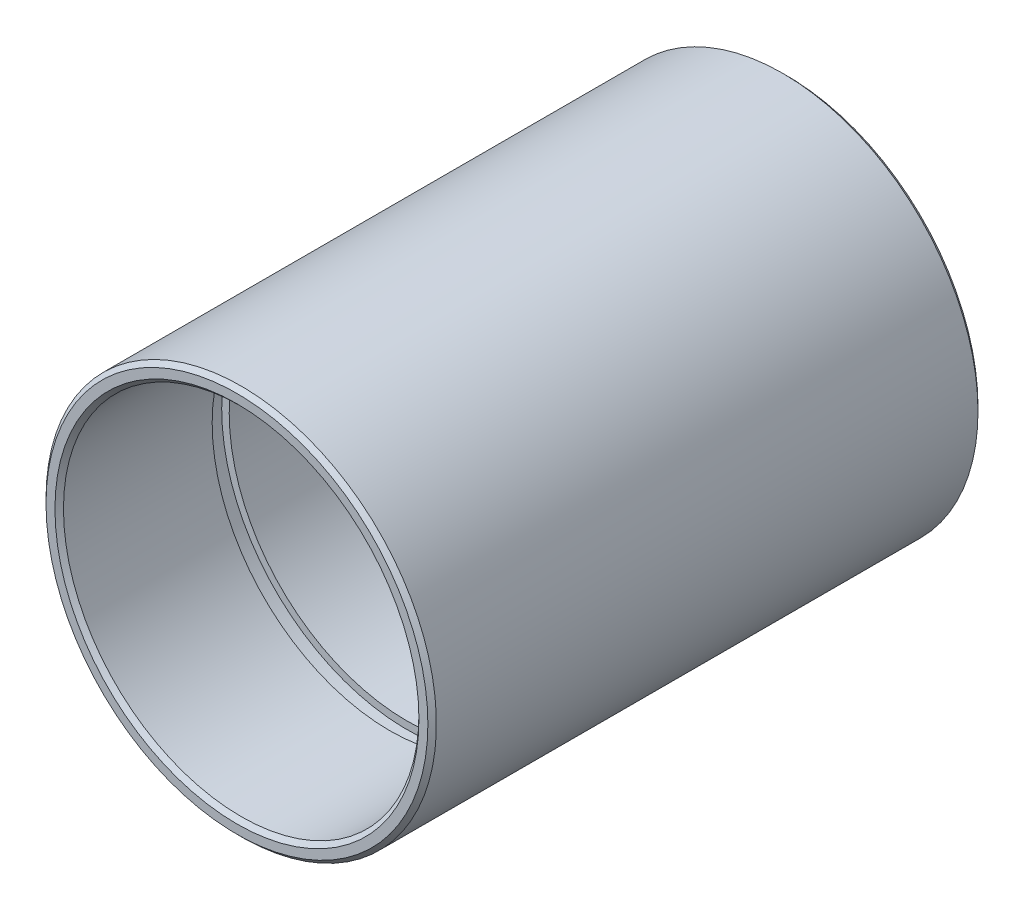
ISO-10303-21;
HEADER;
FILE_DESCRIPTION(('STEP AP214'),'2;1');
FILE_NAME('part.step','',(''),(''),'','','');
FILE_SCHEMA(('AUTOMOTIVE_DESIGN { 1 0 10303 214 1 1 1 1 }'));
ENDSEC;
DATA;
#1=APPLICATION_CONTEXT('core data for automotive mechanical design processes');
#2=APPLICATION_PROTOCOL_DEFINITION('international standard','automotive_design',2000,#1);
#3=PRODUCT_CONTEXT('',#1,'mechanical');
#4=PRODUCT('Part','Part','',(#3));
#5=PRODUCT_RELATED_PRODUCT_CATEGORY('part','',(#4));
#6=PRODUCT_DEFINITION_FORMATION('','',#4);
#7=PRODUCT_DEFINITION_CONTEXT('part definition',#1,'design');
#8=PRODUCT_DEFINITION('design','',#6,#7);
#9=PRODUCT_DEFINITION_SHAPE('','',#8);
#10=(LENGTH_UNIT() NAMED_UNIT(*) SI_UNIT(.MILLI.,.METRE.));
#11=(NAMED_UNIT(*) PLANE_ANGLE_UNIT() SI_UNIT($,.RADIAN.));
#12=(NAMED_UNIT(*) SI_UNIT($,.STERADIAN.) SOLID_ANGLE_UNIT());
#13=UNCERTAINTY_MEASURE_WITH_UNIT(LENGTH_MEASURE(1.E-05),#10,'distance_accuracy_value','');
#14=(GEOMETRIC_REPRESENTATION_CONTEXT(3) GLOBAL_UNCERTAINTY_ASSIGNED_CONTEXT((#13)) GLOBAL_UNIT_ASSIGNED_CONTEXT((#10,
#11,#12)) REPRESENTATION_CONTEXT('',''));
#15=CARTESIAN_POINT('',(0.,0.,0.));
#16=DIRECTION('',(0.,0.,1.));
#17=DIRECTION('',(1.,0.,0.));
#18=AXIS2_PLACEMENT_3D('',#15,#16,#17);
#19=CARTESIAN_POINT('',(0.,0.,49.2125));
#20=DIRECTION('',(0.,0.,-1.));
#21=DIRECTION('',(-1.,0.,0.));
#22=AXIS2_PLACEMENT_3D('',#19,#20,#21);
#23=CYLINDRICAL_SURFACE('',#22,15.9004);
#24=CARTESIAN_POINT('',(0.,0.,15.20825));
#25=DIRECTION('',(0.,0.,1.));
#26=DIRECTION('',(1.,0.,0.));
#27=AXIS2_PLACEMENT_3D('',#24,#25,#26);
#28=CIRCLE('',#27,15.9004);
#29=CARTESIAN_POINT('',(15.9004,0.,15.20825));
#30=VERTEX_POINT('',#29);
#31=EDGE_CURVE('E73',#30,#30,#28,.T.);
#32=ORIENTED_EDGE('',*,*,#31,.F.);
#33=EDGE_LOOP('',(#32));
#34=FACE_BOUND('',#33,.T.);
#35=CARTESIAN_POINT('',(0.,0.,34.00425));
#36=DIRECTION('',(0.,0.,1.));
#37=DIRECTION('',(1.,0.,0.));
#38=AXIS2_PLACEMENT_3D('',#35,#36,#37);
#39=CIRCLE('',#38,15.9004);
#40=CARTESIAN_POINT('',(15.9004,0.,34.00425));
#41=VERTEX_POINT('',#40);
#42=EDGE_CURVE('E67',#41,#41,#39,.T.);
#43=ORIENTED_EDGE('',*,*,#42,.T.);
#44=EDGE_LOOP('',(#43));
#45=FACE_BOUND('',#44,.T.);
#46=ADVANCED_FACE('F30',(#34,#45),#23,.F.);
#47=CARTESIAN_POINT('',(0.,0.,0.381000000000006));
#48=DIRECTION('',(0.,0.,1.));
#49=DIRECTION('',(1.,0.,0.));
#50=AXIS2_PLACEMENT_3D('',#47,#48,#49);
#51=CIRCLE('',#50,15.9004);
#52=CARTESIAN_POINT('',(-15.9004,0.,0.381000000000006));
#53=VERTEX_POINT('',#52);
#54=EDGE_CURVE('E10',#53,#53,#51,.F.);
#55=ORIENTED_EDGE('',*,*,#54,.T.);
#56=EDGE_LOOP('',(#55));
#57=FACE_BOUND('',#56,.T.);
#58=CARTESIAN_POINT('',(0.,0.,13.68425));
#59=DIRECTION('',(0.,0.,1.));
#60=DIRECTION('',(1.,0.,0.));
#61=AXIS2_PLACEMENT_3D('',#58,#59,#60);
#62=CIRCLE('',#61,15.9004);
#63=CARTESIAN_POINT('',(15.9004,0.,13.68425));
#64=VERTEX_POINT('',#63);
#65=EDGE_CURVE('E62',#64,#64,#62,.T.);
#66=ORIENTED_EDGE('',*,*,#65,.T.);
#67=EDGE_LOOP('',(#66));
#68=FACE_BOUND('',#67,.T.);
#69=ADVANCED_FACE('F105',(#57,#68),#23,.F.);
#70=CARTESIAN_POINT('',(0.,0.,49.2125));
#71=DIRECTION('',(0.,0.,1.));
#72=DIRECTION('',(1.,0.,0.));
#73=AXIS2_PLACEMENT_3D('',#70,#71,#72);
#74=PLANE('',#73);
#75=CARTESIAN_POINT('',(0.,0.,49.2125));
#76=DIRECTION('',(0.,0.,1.));
#77=DIRECTION('',(1.,0.,0.));
#78=AXIS2_PLACEMENT_3D('',#75,#76,#77);
#79=CIRCLE('',#78,16.2814);
#80=CARTESIAN_POINT('',(16.2814,0.,49.2125));
#81=VERTEX_POINT('',#80);
#82=EDGE_CURVE('E53',#81,#81,#79,.F.);
#83=ORIENTED_EDGE('',*,*,#82,.T.);
#84=EDGE_LOOP('',(#83));
#85=FACE_BOUND('',#84,.T.);
#86=CARTESIAN_POINT('',(0.,0.,49.2125));
#87=DIRECTION('',(0.,0.,1.));
#88=DIRECTION('',(1.,0.,0.));
#89=AXIS2_PLACEMENT_3D('',#86,#87,#88);
#90=CIRCLE('',#89,17.0815);
#91=CARTESIAN_POINT('',(-17.0815,0.,49.2125));
#92=VERTEX_POINT('',#91);
#93=EDGE_CURVE('E56',#92,#92,#90,.T.);
#94=ORIENTED_EDGE('',*,*,#93,.T.);
#95=EDGE_LOOP('',(#94));
#96=FACE_BOUND('',#95,.T.);
#97=ADVANCED_FACE('F112',(#85,#96),#74,.T.);
#98=CARTESIAN_POINT('',(0.,0.,0.));
#99=DIRECTION('',(0.,0.,1.));
#100=DIRECTION('',(1.,0.,0.));
#101=AXIS2_PLACEMENT_3D('',#98,#99,#100);
#102=PLANE('',#101);
#103=CARTESIAN_POINT('',(0.,0.,0.));
#104=DIRECTION('',(0.,0.,1.));
#105=DIRECTION('',(1.,0.,0.));
#106=AXIS2_PLACEMENT_3D('',#103,#104,#105);
#107=CIRCLE('',#106,16.2814);
#108=CARTESIAN_POINT('',(-16.2814,0.,0.));
#109=VERTEX_POINT('',#108);
#110=EDGE_CURVE('E37',#109,#109,#107,.T.);
#111=ORIENTED_EDGE('',*,*,#110,.T.);
#112=EDGE_LOOP('',(#111));
#113=FACE_BOUND('',#112,.T.);
#114=CARTESIAN_POINT('',(0.,0.,0.));
#115=DIRECTION('',(0.,0.,1.));
#116=DIRECTION('',(1.,0.,0.));
#117=AXIS2_PLACEMENT_3D('',#114,#115,#116);
#118=CIRCLE('',#117,17.0815);
#119=CARTESIAN_POINT('',(17.0815,0.,0.));
#120=VERTEX_POINT('',#119);
#121=EDGE_CURVE('E41',#120,#120,#118,.F.);
#122=ORIENTED_EDGE('',*,*,#121,.T.);
#123=EDGE_LOOP('',(#122));
#124=FACE_BOUND('',#123,.T.);
#125=ADVANCED_FACE('F127',(#113,#124),#102,.F.);
#126=CARTESIAN_POINT('',(0.,0.,49.2125));
#127=DIRECTION('',(0.,0.,-1.));
#128=DIRECTION('',(-1.,0.,0.));
#129=AXIS2_PLACEMENT_3D('',#126,#127,#128);
#130=CYLINDRICAL_SURFACE('',#129,17.4625);
#131=CARTESIAN_POINT('',(0.,0.,48.8315));
#132=DIRECTION('',(0.,0.,1.));
#133=DIRECTION('',(1.,0.,0.));
#134=AXIS2_PLACEMENT_3D('',#131,#132,#133);
#135=CIRCLE('',#134,17.4625);
#136=CARTESIAN_POINT('',(-17.4625,0.,48.8315));
#137=VERTEX_POINT('',#136);
#138=EDGE_CURVE('E45',#137,#137,#135,.F.);
#139=CARTESIAN_POINT('',(0.,0.,0.381000000000006));
#140=DIRECTION('',(0.,0.,1.));
#141=DIRECTION('',(1.,0.,0.));
#142=AXIS2_PLACEMENT_3D('',#139,#140,#141);
#143=CIRCLE('',#142,17.4625);
#144=CARTESIAN_POINT('',(-17.4625,0.,0.380999999999999));
#145=VERTEX_POINT('',#144);
#146=EDGE_CURVE('E50',#145,#145,#143,.T.);
#147=CARTESIAN_POINT('',(-17.4625,0.,48.8315));
#148=CARTESIAN_POINT('',(-17.4625,0.,48.3268072916667));
#149=CARTESIAN_POINT('',(-17.4625,0.,47.8221145833333));
#150=CARTESIAN_POINT('',(-17.4625,0.,46.8127291666667));
#151=CARTESIAN_POINT('',(-17.4625,0.,46.3080364583333));
#152=CARTESIAN_POINT('',(-17.4625,0.,45.2986510416667));
#153=CARTESIAN_POINT('',(-17.4625,0.,44.7939583333333));
#154=CARTESIAN_POINT('',(-17.4625,0.,43.7845729166667));
#155=CARTESIAN_POINT('',(-17.4625,0.,43.2798802083333));
#156=CARTESIAN_POINT('',(-17.4625,0.,42.2704947916667));
#157=CARTESIAN_POINT('',(-17.4625,0.,41.7658020833333));
#158=CARTESIAN_POINT('',(-17.4625,0.,40.7564166666667));
#159=CARTESIAN_POINT('',(-17.4625,0.,40.2517239583333));
#160=CARTESIAN_POINT('',(-17.4625,0.,39.2423385416667));
#161=CARTESIAN_POINT('',(-17.4625,0.,38.7376458333333));
#162=CARTESIAN_POINT('',(-17.4625,0.,37.7282604166667));
#163=CARTESIAN_POINT('',(-17.4625,0.,37.2235677083333));
#164=CARTESIAN_POINT('',(-17.4625,0.,36.2141822916667));
#165=CARTESIAN_POINT('',(-17.4625,0.,35.7094895833333));
#166=CARTESIAN_POINT('',(-17.4625,0.,34.7001041666667));
#167=CARTESIAN_POINT('',(-17.4625,0.,34.1954114583333));
#168=CARTESIAN_POINT('',(-17.4625,0.,33.1860260416667));
#169=CARTESIAN_POINT('',(-17.4625,0.,32.6813333333333));
#170=CARTESIAN_POINT('',(-17.4625,0.,31.6719479166667));
#171=CARTESIAN_POINT('',(-17.4625,0.,31.1672552083333));
#172=CARTESIAN_POINT('',(-17.4625,0.,30.1578697916667));
#173=CARTESIAN_POINT('',(-17.4625,0.,29.6531770833333));
#174=CARTESIAN_POINT('',(-17.4625,0.,28.6437916666667));
#175=CARTESIAN_POINT('',(-17.4625,0.,28.1390989583333));
#176=CARTESIAN_POINT('',(-17.4625,0.,27.1297135416667));
#177=CARTESIAN_POINT('',(-17.4625,0.,26.6250208333333));
#178=CARTESIAN_POINT('',(-17.4625,0.,25.6156354166667));
#179=CARTESIAN_POINT('',(-17.4625,0.,25.1109427083333));
#180=CARTESIAN_POINT('',(-17.4625,0.,24.1015572916667));
#181=CARTESIAN_POINT('',(-17.4625,0.,23.5968645833333));
#182=CARTESIAN_POINT('',(-17.4625,0.,22.5874791666667));
#183=CARTESIAN_POINT('',(-17.4625,0.,22.0827864583333));
#184=CARTESIAN_POINT('',(-17.4625,0.,21.0734010416667));
#185=CARTESIAN_POINT('',(-17.4625,0.,20.5687083333333));
#186=CARTESIAN_POINT('',(-17.4625,0.,19.5593229166667));
#187=CARTESIAN_POINT('',(-17.4625,0.,19.0546302083333));
#188=CARTESIAN_POINT('',(-17.4625,0.,18.0452447916667));
#189=CARTESIAN_POINT('',(-17.4625,0.,17.5405520833333));
#190=CARTESIAN_POINT('',(-17.4625,0.,16.5311666666667));
#191=CARTESIAN_POINT('',(-17.4625,0.,16.0264739583333));
#192=CARTESIAN_POINT('',(-17.4625,0.,15.0170885416667));
#193=CARTESIAN_POINT('',(-17.4625,0.,14.5123958333333));
#194=CARTESIAN_POINT('',(-17.4625,0.,13.5030104166667));
#195=CARTESIAN_POINT('',(-17.4625,0.,12.9983177083333));
#196=CARTESIAN_POINT('',(-17.4625,0.,11.9889322916667));
#197=CARTESIAN_POINT('',(-17.4625,0.,11.4842395833333));
#198=CARTESIAN_POINT('',(-17.4625,0.,10.4748541666667));
#199=CARTESIAN_POINT('',(-17.4625,0.,9.97016145833332));
#200=CARTESIAN_POINT('',(-17.4625,0.,8.96077604166666));
#201=CARTESIAN_POINT('',(-17.4625,0.,8.45608333333332));
#202=CARTESIAN_POINT('',(-17.4625,0.,7.44669791666666));
#203=CARTESIAN_POINT('',(-17.4625,0.,6.94200520833333));
#204=CARTESIAN_POINT('',(-17.4625,0.,5.93261979166666));
#205=CARTESIAN_POINT('',(-17.4625,0.,5.42792708333333));
#206=CARTESIAN_POINT('',(-17.4625,0.,4.41854166666666));
#207=CARTESIAN_POINT('',(-17.4625,0.,3.91384895833333));
#208=CARTESIAN_POINT('',(-17.4625,0.,2.90446354166666));
#209=CARTESIAN_POINT('',(-17.4625,0.,2.39977083333333));
#210=CARTESIAN_POINT('',(-17.4625,0.,1.39038541666666));
#211=CARTESIAN_POINT('',(-17.4625,0.,0.885692708333332));
#212=CARTESIAN_POINT('',(-17.4625,0.,0.380999999999999));
#213=B_SPLINE_CURVE_WITH_KNOTS('',3,(#147,#148,#149,#150,#151,#152,#153,#154,#155,#156,#157,
#158,#159,#160,#161,#162,#163,#164,#165,#166,#167,#168,#169,#170,#171,#172,#173,#174,#175,#176,
#177,#178,#179,#180,#181,#182,#183,#184,#185,#186,#187,#188,#189,#190,#191,#192,#193,#194,#195,
#196,#197,#198,#199,#200,#201,#202,#203,#204,#205,#206,#207,#208,#209,#210,#211,#212),
.UNSPECIFIED.,.F.,.F.,(4,2,2,2,2,2,2,2,2,2,2,2,2,2,2,2,2,2,2,2,2,2,2,2,2,2,2,2,2,2,2,2,4),(0.,
1.514078125,3.02815625,4.542234375,6.05631249999999,7.57039062499999,9.08446874999999,
10.598546875,12.112625,13.626703125,15.14078125,16.654859375,18.1689375,19.683015625,
21.19709375,22.711171875,24.22525,25.739328125,27.25340625,28.767484375,30.2815625,31.795640625,
33.30971875,34.823796875,36.337875,37.851953125,39.36603125,40.880109375,42.3941875,
43.908265625,45.42234375,46.936421875,48.4505),.UNSPECIFIED.);
#214=EDGE_CURVE('BSEAM119',#137,#145,#213,.T.);
#215=ORIENTED_EDGE('',*,*,#138,.T.);
#216=ORIENTED_EDGE('',*,*,#146,.T.);
#217=ORIENTED_EDGE('',*,*,#214,.T.);
#218=ORIENTED_EDGE('',*,*,#214,.F.);
#219=EDGE_LOOP('',(#215,#217,#216,#218));
#220=FACE_BOUND('',#219,.T.);
#221=ADVANCED_FACE('F119',(#220),#130,.T.);
#222=CARTESIAN_POINT('',(0.,0.,48.8315));
#223=DIRECTION('',(0.,0.,1.));
#224=DIRECTION('',(1.,0.,0.));
#225=AXIS2_PLACEMENT_3D('',#222,#223,#224);
#226=CIRCLE('',#225,15.9004);
#227=CARTESIAN_POINT('',(15.9004,0.,48.8315));
#228=VERTEX_POINT('',#227);
#229=EDGE_CURVE('E59',#228,#228,#226,.T.);
#230=ORIENTED_EDGE('',*,*,#229,.T.);
#231=EDGE_LOOP('',(#230));
#232=FACE_BOUND('',#231,.T.);
#233=CARTESIAN_POINT('',(0.,0.,35.52825));
#234=DIRECTION('',(0.,0.,1.));
#235=DIRECTION('',(1.,0.,0.));
#236=AXIS2_PLACEMENT_3D('',#233,#234,#235);
#237=CIRCLE('',#236,15.9004);
#238=CARTESIAN_POINT('',(15.9004,0.,35.52825));
#239=VERTEX_POINT('',#238);
#240=EDGE_CURVE('E63',#239,#239,#237,.T.);
#241=ORIENTED_EDGE('',*,*,#240,.F.);
#242=EDGE_LOOP('',(#241));
#243=FACE_BOUND('',#242,.T.);
#244=ADVANCED_FACE('F108',(#232,#243),#23,.F.);
#245=CARTESIAN_POINT('',(0.,0.,13.68425));
#246=DIRECTION('',(0.,0.,1.));
#247=DIRECTION('',(1.,0.,0.));
#248=AXIS2_PLACEMENT_3D('',#245,#246,#247);
#249=CYLINDRICAL_SURFACE('',#248,16.5735);
#250=CARTESIAN_POINT('',(0.,0.,13.68425));
#251=DIRECTION('',(0.,0.,1.));
#252=DIRECTION('',(1.,0.,0.));
#253=AXIS2_PLACEMENT_3D('',#250,#251,#252);
#254=CIRCLE('',#253,16.5735);
#255=CARTESIAN_POINT('',(16.5735,0.,13.68425));
#256=VERTEX_POINT('',#255);
#257=EDGE_CURVE('E76',#256,#256,#254,.T.);
#258=CARTESIAN_POINT('',(0.,0.,15.20825));
#259=DIRECTION('',(0.,0.,1.));
#260=DIRECTION('',(1.,0.,0.));
#261=AXIS2_PLACEMENT_3D('',#258,#259,#260);
#262=CIRCLE('',#261,16.5735);
#263=CARTESIAN_POINT('',(16.5735,0.,15.20825));
#264=VERTEX_POINT('',#263);
#265=EDGE_CURVE('E66',#264,#264,#262,.T.);
#266=CARTESIAN_POINT('',(16.5735,0.,13.68425));
#267=CARTESIAN_POINT('',(16.5735,0.,13.700125));
#268=CARTESIAN_POINT('',(16.5735,0.,13.716));
#269=CARTESIAN_POINT('',(16.5735,0.,13.74775));
#270=CARTESIAN_POINT('',(16.5735,0.,13.763625));
#271=CARTESIAN_POINT('',(16.5735,0.,13.795375));
#272=CARTESIAN_POINT('',(16.5735,0.,13.81125));
#273=CARTESIAN_POINT('',(16.5735,0.,13.843));
#274=CARTESIAN_POINT('',(16.5735,0.,13.858875));
#275=CARTESIAN_POINT('',(16.5735,0.,13.890625));
#276=CARTESIAN_POINT('',(16.5735,0.,13.9065));
#277=CARTESIAN_POINT('',(16.5735,0.,13.93825));
#278=CARTESIAN_POINT('',(16.5735,0.,13.954125));
#279=CARTESIAN_POINT('',(16.5735,0.,13.985875));
#280=CARTESIAN_POINT('',(16.5735,0.,14.00175));
#281=CARTESIAN_POINT('',(16.5735,0.,14.0335));
#282=CARTESIAN_POINT('',(16.5735,0.,14.049375));
#283=CARTESIAN_POINT('',(16.5735,0.,14.081125));
#284=CARTESIAN_POINT('',(16.5735,0.,14.097));
#285=CARTESIAN_POINT('',(16.5735,0.,14.12875));
#286=CARTESIAN_POINT('',(16.5735,0.,14.144625));
#287=CARTESIAN_POINT('',(16.5735,0.,14.176375));
#288=CARTESIAN_POINT('',(16.5735,0.,14.19225));
#289=CARTESIAN_POINT('',(16.5735,0.,14.224));
#290=CARTESIAN_POINT('',(16.5735,0.,14.239875));
#291=CARTESIAN_POINT('',(16.5735,0.,14.271625));
#292=CARTESIAN_POINT('',(16.5735,0.,14.2875));
#293=CARTESIAN_POINT('',(16.5735,0.,14.31925));
#294=CARTESIAN_POINT('',(16.5735,0.,14.335125));
#295=CARTESIAN_POINT('',(16.5735,0.,14.366875));
#296=CARTESIAN_POINT('',(16.5735,0.,14.38275));
#297=CARTESIAN_POINT('',(16.5735,0.,14.4145));
#298=CARTESIAN_POINT('',(16.5735,0.,14.430375));
#299=CARTESIAN_POINT('',(16.5735,0.,14.462125));
#300=CARTESIAN_POINT('',(16.5735,0.,14.478));
#301=CARTESIAN_POINT('',(16.5735,0.,14.50975));
#302=CARTESIAN_POINT('',(16.5735,0.,14.525625));
#303=CARTESIAN_POINT('',(16.5735,0.,14.557375));
#304=CARTESIAN_POINT('',(16.5735,0.,14.57325));
#305=CARTESIAN_POINT('',(16.5735,0.,14.605));
#306=CARTESIAN_POINT('',(16.5735,0.,14.620875));
#307=CARTESIAN_POINT('',(16.5735,0.,14.652625));
#308=CARTESIAN_POINT('',(16.5735,0.,14.6685));
#309=CARTESIAN_POINT('',(16.5735,0.,14.70025));
#310=CARTESIAN_POINT('',(16.5735,0.,14.716125));
#311=CARTESIAN_POINT('',(16.5735,0.,14.747875));
#312=CARTESIAN_POINT('',(16.5735,0.,14.76375));
#313=CARTESIAN_POINT('',(16.5735,0.,14.7955));
#314=CARTESIAN_POINT('',(16.5735,0.,14.811375));
#315=CARTESIAN_POINT('',(16.5735,0.,14.843125));
#316=CARTESIAN_POINT('',(16.5735,0.,14.859));
#317=CARTESIAN_POINT('',(16.5735,0.,14.89075));
#318=CARTESIAN_POINT('',(16.5735,0.,14.906625));
#319=CARTESIAN_POINT('',(16.5735,0.,14.938375));
#320=CARTESIAN_POINT('',(16.5735,0.,14.95425));
#321=CARTESIAN_POINT('',(16.5735,0.,14.986));
#322=CARTESIAN_POINT('',(16.5735,0.,15.001875));
#323=CARTESIAN_POINT('',(16.5735,0.,15.033625));
#324=CARTESIAN_POINT('',(16.5735,0.,15.0495));
#325=CARTESIAN_POINT('',(16.5735,0.,15.08125));
#326=CARTESIAN_POINT('',(16.5735,0.,15.097125));
#327=CARTESIAN_POINT('',(16.5735,0.,15.128875));
#328=CARTESIAN_POINT('',(16.5735,0.,15.14475));
#329=CARTESIAN_POINT('',(16.5735,0.,15.1765));
#330=CARTESIAN_POINT('',(16.5735,0.,15.192375));
#331=CARTESIAN_POINT('',(16.5735,0.,15.20825));
#332=B_SPLINE_CURVE_WITH_KNOTS('',3,(#266,#267,#268,#269,#270,#271,#272,#273,#274,#275,#276,
#277,#278,#279,#280,#281,#282,#283,#284,#285,#286,#287,#288,#289,#290,#291,#292,#293,#294,#295,
#296,#297,#298,#299,#300,#301,#302,#303,#304,#305,#306,#307,#308,#309,#310,#311,#312,#313,#314,
#315,#316,#317,#318,#319,#320,#321,#322,#323,#324,#325,#326,#327,#328,#329,#330,#331),
.UNSPECIFIED.,.F.,.F.,(4,2,2,2,2,2,2,2,2,2,2,2,2,2,2,2,2,2,2,2,2,2,2,2,2,2,2,2,2,2,2,2,4),(0.,
0.0476250000000008,0.0952500000000016,0.142875000000001,0.190500000000001,0.238125,
0.285750000000001,0.333375,0.381000000000001,0.428625,0.476250000000001,0.523875,
0.571500000000001,0.619125,0.666750000000001,0.714375,0.762000000000001,0.809625,0.85725,
0.904875000000001,0.9525,1.000125,1.04775,1.095375,1.143,1.190625,1.23825,1.285875,1.3335,
1.381125,1.42875,1.476375,1.524),.UNSPECIFIED.);
#333=EDGE_CURVE('BSEAM118',#256,#264,#332,.T.);
#334=ORIENTED_EDGE('',*,*,#257,.F.);
#335=ORIENTED_EDGE('',*,*,#265,.T.);
#336=ORIENTED_EDGE('',*,*,#333,.T.);
#337=ORIENTED_EDGE('',*,*,#333,.F.);
#338=EDGE_LOOP('',(#334,#336,#335,#337));
#339=FACE_BOUND('',#338,.T.);
#340=ADVANCED_FACE('F118',(#339),#249,.F.);
#341=CARTESIAN_POINT('',(0.,0.,13.68425));
#342=DIRECTION('',(0.,0.,1.));
#343=DIRECTION('',(1.,0.,0.));
#344=AXIS2_PLACEMENT_3D('',#341,#342,#343);
#345=PLANE('',#344);
#346=ORIENTED_EDGE('',*,*,#65,.F.);
#347=EDGE_LOOP('',(#346));
#348=FACE_BOUND('',#347,.T.);
#349=ORIENTED_EDGE('',*,*,#257,.T.);
#350=EDGE_LOOP('',(#349));
#351=FACE_BOUND('',#350,.T.);
#352=ADVANCED_FACE('F125',(#348,#351),#345,.T.);
#353=CARTESIAN_POINT('',(0.,0.,15.20825));
#354=DIRECTION('',(0.,0.,1.));
#355=DIRECTION('',(1.,0.,0.));
#356=AXIS2_PLACEMENT_3D('',#353,#354,#355);
#357=PLANE('',#356);
#358=ORIENTED_EDGE('',*,*,#31,.T.);
#359=EDGE_LOOP('',(#358));
#360=FACE_BOUND('',#359,.T.);
#361=ORIENTED_EDGE('',*,*,#265,.F.);
#362=EDGE_LOOP('',(#361));
#363=FACE_BOUND('',#362,.T.);
#364=ADVANCED_FACE('F102',(#360,#363),#357,.F.);
#365=CARTESIAN_POINT('',(0.,0.,35.52825));
#366=DIRECTION('',(0.,0.,-1.));
#367=DIRECTION('',(-1.,0.,0.));
#368=AXIS2_PLACEMENT_3D('',#365,#366,#367);
#369=CYLINDRICAL_SURFACE('',#368,16.5735);
#370=CARTESIAN_POINT('',(0.,0.,35.52825));
#371=DIRECTION('',(0.,0.,1.));
#372=DIRECTION('',(1.,0.,0.));
#373=AXIS2_PLACEMENT_3D('',#370,#371,#372);
#374=CIRCLE('',#373,16.5735);
#375=CARTESIAN_POINT('',(-16.5735,0.,35.52825));
#376=VERTEX_POINT('',#375);
#377=EDGE_CURVE('E70',#376,#376,#374,.T.);
#378=CARTESIAN_POINT('',(0.,0.,34.00425));
#379=DIRECTION('',(0.,0.,1.));
#380=DIRECTION('',(1.,0.,0.));
#381=AXIS2_PLACEMENT_3D('',#378,#379,#380);
#382=CIRCLE('',#381,16.5735);
#383=CARTESIAN_POINT('',(-16.5735,0.,34.00425));
#384=VERTEX_POINT('',#383);
#385=EDGE_CURVE('E81',#384,#384,#382,.T.);
#386=CARTESIAN_POINT('',(-16.5735,0.,35.52825));
#387=CARTESIAN_POINT('',(-16.5735,0.,35.512375));
#388=CARTESIAN_POINT('',(-16.5735,0.,35.4965));
#389=CARTESIAN_POINT('',(-16.5735,0.,35.46475));
#390=CARTESIAN_POINT('',(-16.5735,0.,35.448875));
#391=CARTESIAN_POINT('',(-16.5735,0.,35.417125));
#392=CARTESIAN_POINT('',(-16.5735,0.,35.40125));
#393=CARTESIAN_POINT('',(-16.5735,0.,35.3695));
#394=CARTESIAN_POINT('',(-16.5735,0.,35.353625));
#395=CARTESIAN_POINT('',(-16.5735,0.,35.321875));
#396=CARTESIAN_POINT('',(-16.5735,0.,35.306));
#397=CARTESIAN_POINT('',(-16.5735,0.,35.27425));
#398=CARTESIAN_POINT('',(-16.5735,0.,35.258375));
#399=CARTESIAN_POINT('',(-16.5735,0.,35.226625));
#400=CARTESIAN_POINT('',(-16.5735,0.,35.21075));
#401=CARTESIAN_POINT('',(-16.5735,0.,35.179));
#402=CARTESIAN_POINT('',(-16.5735,0.,35.163125));
#403=CARTESIAN_POINT('',(-16.5735,0.,35.131375));
#404=CARTESIAN_POINT('',(-16.5735,0.,35.1155));
#405=CARTESIAN_POINT('',(-16.5735,0.,35.08375));
#406=CARTESIAN_POINT('',(-16.5735,0.,35.067875));
#407=CARTESIAN_POINT('',(-16.5735,0.,35.036125));
#408=CARTESIAN_POINT('',(-16.5735,0.,35.02025));
#409=CARTESIAN_POINT('',(-16.5735,0.,34.9885));
#410=CARTESIAN_POINT('',(-16.5735,0.,34.972625));
#411=CARTESIAN_POINT('',(-16.5735,0.,34.940875));
#412=CARTESIAN_POINT('',(-16.5735,0.,34.925));
#413=CARTESIAN_POINT('',(-16.5735,0.,34.89325));
#414=CARTESIAN_POINT('',(-16.5735,0.,34.877375));
#415=CARTESIAN_POINT('',(-16.5735,0.,34.845625));
#416=CARTESIAN_POINT('',(-16.5735,0.,34.82975));
#417=CARTESIAN_POINT('',(-16.5735,0.,34.798));
#418=CARTESIAN_POINT('',(-16.5735,0.,34.782125));
#419=CARTESIAN_POINT('',(-16.5735,0.,34.750375));
#420=CARTESIAN_POINT('',(-16.5735,0.,34.7345));
#421=CARTESIAN_POINT('',(-16.5735,0.,34.70275));
#422=CARTESIAN_POINT('',(-16.5735,0.,34.686875));
#423=CARTESIAN_POINT('',(-16.5735,0.,34.655125));
#424=CARTESIAN_POINT('',(-16.5735,0.,34.63925));
#425=CARTESIAN_POINT('',(-16.5735,0.,34.6075));
#426=CARTESIAN_POINT('',(-16.5735,0.,34.591625));
#427=CARTESIAN_POINT('',(-16.5735,0.,34.559875));
#428=CARTESIAN_POINT('',(-16.5735,0.,34.544));
#429=CARTESIAN_POINT('',(-16.5735,0.,34.51225));
#430=CARTESIAN_POINT('',(-16.5735,0.,34.496375));
#431=CARTESIAN_POINT('',(-16.5735,0.,34.464625));
#432=CARTESIAN_POINT('',(-16.5735,0.,34.44875));
#433=CARTESIAN_POINT('',(-16.5735,0.,34.417));
#434=CARTESIAN_POINT('',(-16.5735,0.,34.401125));
#435=CARTESIAN_POINT('',(-16.5735,0.,34.369375));
#436=CARTESIAN_POINT('',(-16.5735,0.,34.3535));
#437=CARTESIAN_POINT('',(-16.5735,0.,34.32175));
#438=CARTESIAN_POINT('',(-16.5735,0.,34.305875));
#439=CARTESIAN_POINT('',(-16.5735,0.,34.274125));
#440=CARTESIAN_POINT('',(-16.5735,0.,34.25825));
#441=CARTESIAN_POINT('',(-16.5735,0.,34.2265));
#442=CARTESIAN_POINT('',(-16.5735,0.,34.210625));
#443=CARTESIAN_POINT('',(-16.5735,0.,34.178875));
#444=CARTESIAN_POINT('',(-16.5735,0.,34.163));
#445=CARTESIAN_POINT('',(-16.5735,0.,34.13125));
#446=CARTESIAN_POINT('',(-16.5735,0.,34.115375));
#447=CARTESIAN_POINT('',(-16.5735,0.,34.083625));
#448=CARTESIAN_POINT('',(-16.5735,0.,34.06775));
#449=CARTESIAN_POINT('',(-16.5735,0.,34.036));
#450=CARTESIAN_POINT('',(-16.5735,0.,34.020125));
#451=CARTESIAN_POINT('',(-16.5735,0.,34.00425));
#452=B_SPLINE_CURVE_WITH_KNOTS('',3,(#386,#387,#388,#389,#390,#391,#392,#393,#394,#395,#396,
#397,#398,#399,#400,#401,#402,#403,#404,#405,#406,#407,#408,#409,#410,#411,#412,#413,#414,#415,
#416,#417,#418,#419,#420,#421,#422,#423,#424,#425,#426,#427,#428,#429,#430,#431,#432,#433,#434,
#435,#436,#437,#438,#439,#440,#441,#442,#443,#444,#445,#446,#447,#448,#449,#450,#451),
.UNSPECIFIED.,.F.,.F.,(4,2,2,2,2,2,2,2,2,2,2,2,2,2,2,2,2,2,2,2,2,2,2,2,2,2,2,2,2,2,2,2,4),(0.,
0.0476250000000025,0.0952500000000051,0.142875000000001,0.190500000000003,0.238125000000006,
0.285750000000001,0.333375000000004,0.381000000000006,0.428625000000002,0.476250000000004,
0.523875,0.571500000000003,0.619125000000005,0.666750000000001,0.714375000000003,
0.762000000000006,0.809625000000001,0.857250000000004,0.904874999999999,0.952500000000002,
1.000125,1.04775,1.095375,1.14300000000001,1.190625,1.23825,1.285875,1.3335,1.381125,1.42875,
1.476375,1.524),.UNSPECIFIED.);
#453=EDGE_CURVE('BSEAM87',#376,#384,#452,.T.);
#454=ORIENTED_EDGE('',*,*,#377,.T.);
#455=ORIENTED_EDGE('',*,*,#385,.F.);
#456=ORIENTED_EDGE('',*,*,#453,.T.);
#457=ORIENTED_EDGE('',*,*,#453,.F.);
#458=EDGE_LOOP('',(#454,#456,#455,#457));
#459=FACE_BOUND('',#458,.T.);
#460=ADVANCED_FACE('F87',(#459),#369,.F.);
#461=CARTESIAN_POINT('',(0.,0.,35.52825));
#462=DIRECTION('',(0.,0.,1.));
#463=DIRECTION('',(1.,0.,0.));
#464=AXIS2_PLACEMENT_3D('',#461,#462,#463);
#465=PLANE('',#464);
#466=ORIENTED_EDGE('',*,*,#240,.T.);
#467=EDGE_LOOP('',(#466));
#468=FACE_BOUND('',#467,.T.);
#469=ORIENTED_EDGE('',*,*,#377,.F.);
#470=EDGE_LOOP('',(#469));
#471=FACE_BOUND('',#470,.T.);
#472=ADVANCED_FACE('F90',(#468,#471),#465,.F.);
#473=CARTESIAN_POINT('',(0.,0.,34.00425));
#474=DIRECTION('',(0.,0.,1.));
#475=DIRECTION('',(1.,0.,0.));
#476=AXIS2_PLACEMENT_3D('',#473,#474,#475);
#477=PLANE('',#476);
#478=ORIENTED_EDGE('',*,*,#42,.F.);
#479=EDGE_LOOP('',(#478));
#480=FACE_BOUND('',#479,.T.);
#481=ORIENTED_EDGE('',*,*,#385,.T.);
#482=EDGE_LOOP('',(#481));
#483=FACE_BOUND('',#482,.T.);
#484=ADVANCED_FACE('F92',(#480,#483),#477,.T.);
#485=CARTESIAN_POINT('',(0.,0.,48.8315));
#486=DIRECTION('',(0.,0.,1.));
#487=DIRECTION('',(1.,0.,0.));
#488=AXIS2_PLACEMENT_3D('',#485,#486,#487);
#489=CONICAL_SURFACE('',#488,15.9004,0.785398163397444);
#490=CARTESIAN_POINT('',(16.2814,0.,49.2125));
#491=CARTESIAN_POINT('',(16.27743125,0.,49.20853125));
#492=CARTESIAN_POINT('',(16.2734625,0.,49.2045625));
#493=CARTESIAN_POINT('',(16.265525,0.,49.196625));
#494=CARTESIAN_POINT('',(16.26155625,0.,49.19265625));
#495=CARTESIAN_POINT('',(16.25361875,0.,49.18471875));
#496=CARTESIAN_POINT('',(16.24965,0.,49.18075));
#497=CARTESIAN_POINT('',(16.2417125,0.,49.1728125));
#498=CARTESIAN_POINT('',(16.23774375,0.,49.16884375));
#499=CARTESIAN_POINT('',(16.22980625,0.,49.16090625));
#500=CARTESIAN_POINT('',(16.2258375,0.,49.1569375));
#501=CARTESIAN_POINT('',(16.2179,0.,49.149));
#502=CARTESIAN_POINT('',(16.21393125,0.,49.14503125));
#503=CARTESIAN_POINT('',(16.20599375,0.,49.13709375));
#504=CARTESIAN_POINT('',(16.202025,0.,49.133125));
#505=CARTESIAN_POINT('',(16.1940875,0.,49.1251875));
#506=CARTESIAN_POINT('',(16.19011875,0.,49.12121875));
#507=CARTESIAN_POINT('',(16.18218125,0.,49.11328125));
#508=CARTESIAN_POINT('',(16.1782125,0.,49.1093125));
#509=CARTESIAN_POINT('',(16.170275,0.,49.101375));
#510=CARTESIAN_POINT('',(16.16630625,0.,49.09740625));
#511=CARTESIAN_POINT('',(16.15836875,0.,49.08946875));
#512=CARTESIAN_POINT('',(16.1544,0.,49.0855));
#513=CARTESIAN_POINT('',(16.1464625,0.,49.0775625));
#514=CARTESIAN_POINT('',(16.14249375,0.,49.07359375));
#515=CARTESIAN_POINT('',(16.13455625,0.,49.06565625));
#516=CARTESIAN_POINT('',(16.1305875,0.,49.0616875));
#517=CARTESIAN_POINT('',(16.12265,0.,49.05375));
#518=CARTESIAN_POINT('',(16.11868125,0.,49.04978125));
#519=CARTESIAN_POINT('',(16.11074375,0.,49.04184375));
#520=CARTESIAN_POINT('',(16.106775,0.,49.037875));
#521=CARTESIAN_POINT('',(16.0988375,0.,49.0299375));
#522=CARTESIAN_POINT('',(16.09486875,0.,49.02596875));
#523=CARTESIAN_POINT('',(16.08693125,0.,49.01803125));
#524=CARTESIAN_POINT('',(16.0829625,0.,49.0140625));
#525=CARTESIAN_POINT('',(16.075025,0.,49.006125));
#526=CARTESIAN_POINT('',(16.07105625,0.,49.00215625));
#527=CARTESIAN_POINT('',(16.06311875,0.,48.99421875));
#528=CARTESIAN_POINT('',(16.05915,0.,48.99025));
#529=CARTESIAN_POINT('',(16.0512125,0.,48.9823125));
#530=CARTESIAN_POINT('',(16.04724375,0.,48.97834375));
#531=CARTESIAN_POINT('',(16.03930625,0.,48.97040625));
#532=CARTESIAN_POINT('',(16.0353375,0.,48.9664375));
#533=CARTESIAN_POINT('',(16.0274,0.,48.9585));
#534=CARTESIAN_POINT('',(16.02343125,0.,48.95453125));
#535=CARTESIAN_POINT('',(16.01549375,0.,48.94659375));
#536=CARTESIAN_POINT('',(16.011525,0.,48.942625));
#537=CARTESIAN_POINT('',(16.0035875,0.,48.9346875));
#538=CARTESIAN_POINT('',(15.99961875,0.,48.93071875));
#539=CARTESIAN_POINT('',(15.99168125,0.,48.92278125));
#540=CARTESIAN_POINT('',(15.9877125,0.,48.9188125));
#541=CARTESIAN_POINT('',(15.979775,0.,48.910875));
#542=CARTESIAN_POINT('',(15.97580625,0.,48.90690625));
#543=CARTESIAN_POINT('',(15.96786875,0.,48.89896875));
#544=CARTESIAN_POINT('',(15.9639,0.,48.895));
#545=CARTESIAN_POINT('',(15.9559625,0.,48.8870625));
#546=CARTESIAN_POINT('',(15.95199375,0.,48.88309375));
#547=CARTESIAN_POINT('',(15.94405625,0.,48.87515625));
#548=CARTESIAN_POINT('',(15.9400875,0.,48.8711875));
#549=CARTESIAN_POINT('',(15.93215,0.,48.86325));
#550=CARTESIAN_POINT('',(15.92818125,0.,48.85928125));
#551=CARTESIAN_POINT('',(15.92024375,0.,48.85134375));
#552=CARTESIAN_POINT('',(15.916275,0.,48.847375));
#553=CARTESIAN_POINT('',(15.9083375,0.,48.8394375));
#554=CARTESIAN_POINT('',(15.90436875,0.,48.83546875));
#555=CARTESIAN_POINT('',(15.9004,0.,48.8315));
#556=B_SPLINE_CURVE_WITH_KNOTS('',3,(#490,#491,#492,#493,#494,#495,#496,#497,#498,#499,#500,
#501,#502,#503,#504,#505,#506,#507,#508,#509,#510,#511,#512,#513,#514,#515,#516,#517,#518,#519,
#520,#521,#522,#523,#524,#525,#526,#527,#528,#529,#530,#531,#532,#533,#534,#535,#536,#537,#538,
#539,#540,#541,#542,#543,#544,#545,#546,#547,#548,#549,#550,#551,#552,#553,#554,#555),
.UNSPECIFIED.,.F.,.F.,(4,2,2,2,2,2,2,2,2,2,2,2,2,2,2,2,2,2,2,2,2,2,2,2,2,2,2,2,2,2,2,2,4),(0.,
0.016837980227008,0.0336759604540136,0.0505139406810167,0.0673519209080198,0.0841899011350253,
0.101027881362033,0.117865861589036,0.134703841816042,0.151541822043045,0.168379802270048,
0.185217782497059,0.202055762724062,0.218893742951065,0.23573172317807,0.252569703405074,
0.269407683632077,0.286245663859087,0.30308364408609,0.319921624313096,0.336759604540099,
0.353597584767102,0.370435564994112,0.387273545221115,0.404111525448119,0.420949505675124,
0.437787485902127,0.454625466129135,0.471463446356141,0.488301426583144,0.505139406810147,
0.521977387037153,0.538815367264156),.UNSPECIFIED.);
#557=EDGE_CURVE('BSEAM99',#81,#228,#556,.T.);
#558=ORIENTED_EDGE('',*,*,#82,.F.);
#559=ORIENTED_EDGE('',*,*,#229,.F.);
#560=ORIENTED_EDGE('',*,*,#557,.T.);
#561=ORIENTED_EDGE('',*,*,#557,.F.);
#562=EDGE_LOOP('',(#558,#560,#559,#561));
#563=FACE_BOUND('',#562,.T.);
#564=ADVANCED_FACE('F99',(#563),#489,.F.);
#565=CARTESIAN_POINT('',(0.,0.,49.2125));
#566=DIRECTION('',(0.,0.,-1.));
#567=DIRECTION('',(-1.,0.,0.));
#568=AXIS2_PLACEMENT_3D('',#565,#566,#567);
#569=CONICAL_SURFACE('',#568,17.0815,0.785398163397444);
#570=CARTESIAN_POINT('',(-17.4625,0.,48.8315));
#571=CARTESIAN_POINT('',(-17.45853125,0.,48.83546875));
#572=CARTESIAN_POINT('',(-17.4545625,0.,48.8394375));
#573=CARTESIAN_POINT('',(-17.446625,0.,48.847375));
#574=CARTESIAN_POINT('',(-17.44265625,0.,48.85134375));
#575=CARTESIAN_POINT('',(-17.43471875,0.,48.85928125));
#576=CARTESIAN_POINT('',(-17.43075,0.,48.86325));
#577=CARTESIAN_POINT('',(-17.4228125,0.,48.8711875));
#578=CARTESIAN_POINT('',(-17.41884375,0.,48.87515625));
#579=CARTESIAN_POINT('',(-17.41090625,0.,48.88309375));
#580=CARTESIAN_POINT('',(-17.4069375,0.,48.8870625));
#581=CARTESIAN_POINT('',(-17.399,0.,48.895));
#582=CARTESIAN_POINT('',(-17.39503125,0.,48.89896875));
#583=CARTESIAN_POINT('',(-17.38709375,0.,48.90690625));
#584=CARTESIAN_POINT('',(-17.383125,0.,48.910875));
#585=CARTESIAN_POINT('',(-17.3751875,0.,48.9188125));
#586=CARTESIAN_POINT('',(-17.37121875,0.,48.92278125));
#587=CARTESIAN_POINT('',(-17.36328125,0.,48.93071875));
#588=CARTESIAN_POINT('',(-17.3593125,0.,48.9346875));
#589=CARTESIAN_POINT('',(-17.351375,0.,48.942625));
#590=CARTESIAN_POINT('',(-17.34740625,0.,48.94659375));
#591=CARTESIAN_POINT('',(-17.33946875,0.,48.95453125));
#592=CARTESIAN_POINT('',(-17.3355,0.,48.9585));
#593=CARTESIAN_POINT('',(-17.3275625,0.,48.9664375));
#594=CARTESIAN_POINT('',(-17.32359375,0.,48.97040625));
#595=CARTESIAN_POINT('',(-17.31565625,0.,48.97834375));
#596=CARTESIAN_POINT('',(-17.3116875,0.,48.9823125));
#597=CARTESIAN_POINT('',(-17.30375,0.,48.99025));
#598=CARTESIAN_POINT('',(-17.29978125,0.,48.99421875));
#599=CARTESIAN_POINT('',(-17.29184375,0.,49.00215625));
#600=CARTESIAN_POINT('',(-17.287875,0.,49.006125));
#601=CARTESIAN_POINT('',(-17.2799375,0.,49.0140625));
#602=CARTESIAN_POINT('',(-17.27596875,0.,49.01803125));
#603=CARTESIAN_POINT('',(-17.26803125,0.,49.02596875));
#604=CARTESIAN_POINT('',(-17.2640625,0.,49.0299375));
#605=CARTESIAN_POINT('',(-17.256125,0.,49.037875));
#606=CARTESIAN_POINT('',(-17.25215625,0.,49.04184375));
#607=CARTESIAN_POINT('',(-17.24421875,0.,49.04978125));
#608=CARTESIAN_POINT('',(-17.24025,0.,49.05375));
#609=CARTESIAN_POINT('',(-17.2323125,0.,49.0616875));
#610=CARTESIAN_POINT('',(-17.22834375,0.,49.06565625));
#611=CARTESIAN_POINT('',(-17.22040625,0.,49.07359375));
#612=CARTESIAN_POINT('',(-17.2164375,0.,49.0775625));
#613=CARTESIAN_POINT('',(-17.2085,0.,49.0855));
#614=CARTESIAN_POINT('',(-17.20453125,0.,49.08946875));
#615=CARTESIAN_POINT('',(-17.19659375,0.,49.09740625));
#616=CARTESIAN_POINT('',(-17.192625,0.,49.101375));
#617=CARTESIAN_POINT('',(-17.1846875,0.,49.1093125));
#618=CARTESIAN_POINT('',(-17.18071875,0.,49.11328125));
#619=CARTESIAN_POINT('',(-17.17278125,0.,49.12121875));
#620=CARTESIAN_POINT('',(-17.1688125,0.,49.1251875));
#621=CARTESIAN_POINT('',(-17.160875,0.,49.133125));
#622=CARTESIAN_POINT('',(-17.15690625,0.,49.13709375));
#623=CARTESIAN_POINT('',(-17.14896875,0.,49.14503125));
#624=CARTESIAN_POINT('',(-17.145,0.,49.149));
#625=CARTESIAN_POINT('',(-17.1370625,0.,49.1569375));
#626=CARTESIAN_POINT('',(-17.13309375,0.,49.16090625));
#627=CARTESIAN_POINT('',(-17.12515625,0.,49.16884375));
#628=CARTESIAN_POINT('',(-17.1211875,0.,49.1728125));
#629=CARTESIAN_POINT('',(-17.11325,0.,49.18075));
#630=CARTESIAN_POINT('',(-17.10928125,0.,49.18471875));
#631=CARTESIAN_POINT('',(-17.10134375,0.,49.19265625));
#632=CARTESIAN_POINT('',(-17.097375,0.,49.196625));
#633=CARTESIAN_POINT('',(-17.0894375,0.,49.2045625));
#634=CARTESIAN_POINT('',(-17.08546875,0.,49.20853125));
#635=CARTESIAN_POINT('',(-17.0815,0.,49.2125));
#636=B_SPLINE_CURVE_WITH_KNOTS('',3,(#570,#571,#572,#573,#574,#575,#576,#577,#578,#579,#580,
#581,#582,#583,#584,#585,#586,#587,#588,#589,#590,#591,#592,#593,#594,#595,#596,#597,#598,#599,
#600,#601,#602,#603,#604,#605,#606,#607,#608,#609,#610,#611,#612,#613,#614,#615,#616,#617,#618,
#619,#620,#621,#622,#623,#624,#625,#626,#627,#628,#629,#630,#631,#632,#633,#634,#635),
.UNSPECIFIED.,.F.,.F.,(4,2,2,2,2,2,2,2,2,2,2,2,2,2,2,2,2,2,2,2,2,2,2,2,2,2,2,2,2,2,2,2,4),(0.,
0.0168379802270031,0.0336759604540087,0.0505139406810118,0.0673519209080149,0.0841899011350204,
0.101027881362028,0.117865861589032,0.134703841816037,0.15154182204304,0.168379802270043,
0.185217782497054,0.202055762724057,0.21889374295106,0.235731723178066,0.252569703405069,
0.269407683632077,0.286245663859082,0.303083644086085,0.319921624313091,0.336759604540094,
0.353597584767097,0.370435564994108,0.387273545221111,0.404111525448114,0.420949505675119,
0.437787485902122,0.45462546612913,0.471463446356136,0.488301426583139,0.505139406810142,
0.521977387037148,0.538815367264156),.UNSPECIFIED.);
#637=EDGE_CURVE('BSEAM135',#137,#92,#636,.T.);
#638=ORIENTED_EDGE('',*,*,#138,.F.);
#639=ORIENTED_EDGE('',*,*,#93,.F.);
#640=ORIENTED_EDGE('',*,*,#637,.T.);
#641=ORIENTED_EDGE('',*,*,#637,.F.);
#642=EDGE_LOOP('',(#638,#640,#639,#641));
#643=FACE_BOUND('',#642,.T.);
#644=ADVANCED_FACE('F135',(#643),#569,.T.);
#645=CARTESIAN_POINT('',(0.,0.,0.));
#646=DIRECTION('',(0.,0.,-1.));
#647=DIRECTION('',(-1.,0.,0.));
#648=AXIS2_PLACEMENT_3D('',#645,#646,#647);
#649=CONICAL_SURFACE('',#648,16.2814,0.785398163397444);
#650=CARTESIAN_POINT('',(-15.9004,0.,0.381000000000006));
#651=CARTESIAN_POINT('',(-15.90436875,0.,0.377031250000005));
#652=CARTESIAN_POINT('',(-15.9083375,0.,0.373062500000006));
#653=CARTESIAN_POINT('',(-15.916275,0.,0.365125000000006));
#654=CARTESIAN_POINT('',(-15.92024375,0.,0.361156250000006));
#655=CARTESIAN_POINT('',(-15.92818125,0.,0.353218750000006));
#656=CARTESIAN_POINT('',(-15.93215,0.,0.349250000000006));
#657=CARTESIAN_POINT('',(-15.9400875,0.,0.341312500000005));
#658=CARTESIAN_POINT('',(-15.94405625,0.,0.337343750000005));
#659=CARTESIAN_POINT('',(-15.95199375,0.,0.329406250000005));
#660=CARTESIAN_POINT('',(-15.9559625,0.,0.325437500000006));
#661=CARTESIAN_POINT('',(-15.9639,0.,0.317500000000006));
#662=CARTESIAN_POINT('',(-15.96786875,0.,0.313531250000005));
#663=CARTESIAN_POINT('',(-15.97580625,0.,0.305593750000005));
#664=CARTESIAN_POINT('',(-15.979775,0.,0.301625000000005));
#665=CARTESIAN_POINT('',(-15.9877125,0.,0.293687500000005));
#666=CARTESIAN_POINT('',(-15.99168125,0.,0.289718750000005));
#667=CARTESIAN_POINT('',(-15.99961875,0.,0.281781250000005));
#668=CARTESIAN_POINT('',(-16.0035875,0.,0.277812500000005));
#669=CARTESIAN_POINT('',(-16.011525,0.,0.269875000000004));
#670=CARTESIAN_POINT('',(-16.01549375,0.,0.265906250000004));
#671=CARTESIAN_POINT('',(-16.02343125,0.,0.257968750000004));
#672=CARTESIAN_POINT('',(-16.0274,0.,0.254000000000004));
#673=CARTESIAN_POINT('',(-16.0353375,0.,0.246062500000004));
#674=CARTESIAN_POINT('',(-16.03930625,0.,0.242093750000004));
#675=CARTESIAN_POINT('',(-16.04724375,0.,0.234156250000004));
#676=CARTESIAN_POINT('',(-16.0512125,0.,0.230187500000003));
#677=CARTESIAN_POINT('',(-16.05915,0.,0.222250000000003));
#678=CARTESIAN_POINT('',(-16.06311875,0.,0.218281250000004));
#679=CARTESIAN_POINT('',(-16.07105625,0.,0.210343750000004));
#680=CARTESIAN_POINT('',(-16.075025,0.,0.206375000000004));
#681=CARTESIAN_POINT('',(-16.0829625,0.,0.198437500000003));
#682=CARTESIAN_POINT('',(-16.08693125,0.,0.194468750000003));
#683=CARTESIAN_POINT('',(-16.09486875,0.,0.186531250000003));
#684=CARTESIAN_POINT('',(-16.0988375,0.,0.182562500000003));
#685=CARTESIAN_POINT('',(-16.106775,0.,0.174625000000003));
#686=CARTESIAN_POINT('',(-16.11074375,0.,0.170656250000003));
#687=CARTESIAN_POINT('',(-16.11868125,0.,0.162718750000002));
#688=CARTESIAN_POINT('',(-16.12265,0.,0.158750000000003));
#689=CARTESIAN_POINT('',(-16.1305875,0.,0.150812500000003));
#690=CARTESIAN_POINT('',(-16.13455625,0.,0.146843750000003));
#691=CARTESIAN_POINT('',(-16.14249375,0.,0.138906250000002));
#692=CARTESIAN_POINT('',(-16.1464625,0.,0.134937500000002));
#693=CARTESIAN_POINT('',(-16.1544,0.,0.127000000000002));
#694=CARTESIAN_POINT('',(-16.15836875,0.,0.123031250000002));
#695=CARTESIAN_POINT('',(-16.16630625,0.,0.115093750000002));
#696=CARTESIAN_POINT('',(-16.170275,0.,0.111125000000002));
#697=CARTESIAN_POINT('',(-16.1782125,0.,0.103187500000002));
#698=CARTESIAN_POINT('',(-16.18218125,0.,0.0992187500000013));
#699=CARTESIAN_POINT('',(-16.19011875,0.,0.0912812500000013));
#700=CARTESIAN_POINT('',(-16.1940875,0.,0.0873125000000016));
#701=CARTESIAN_POINT('',(-16.202025,0.,0.0793750000000017));
#702=CARTESIAN_POINT('',(-16.20599375,0.,0.0754062500000014));
#703=CARTESIAN_POINT('',(-16.21393125,0.,0.0674687500000009));
#704=CARTESIAN_POINT('',(-16.2179,0.,0.0635000000000007));
#705=CARTESIAN_POINT('',(-16.2258375,0.,0.0555625000000007));
#706=CARTESIAN_POINT('',(-16.22980625,0.,0.051593750000001));
#707=CARTESIAN_POINT('',(-16.23774375,0.,0.0436562500000011));
#708=CARTESIAN_POINT('',(-16.2417125,0.,0.0396875000000008));
#709=CARTESIAN_POINT('',(-16.24965,0.,0.0317500000000003));
#710=CARTESIAN_POINT('',(-16.25361875,0.,0.0277812500000001));
#711=CARTESIAN_POINT('',(-16.26155625,0.,0.0198437500000001));
#712=CARTESIAN_POINT('',(-16.265525,0.,0.0158750000000003));
#713=CARTESIAN_POINT('',(-16.2734625,0.,0.00793750000000068));
#714=CARTESIAN_POINT('',(-16.27743125,0.,0.00396875000000088));
#715=CARTESIAN_POINT('',(-16.2814,0.,0.));
#716=B_SPLINE_CURVE_WITH_KNOTS('',3,(#650,#651,#652,#653,#654,#655,#656,#657,#658,#659,#660,
#661,#662,#663,#664,#665,#666,#667,#668,#669,#670,#671,#672,#673,#674,#675,#676,#677,#678,#679,
#680,#681,#682,#683,#684,#685,#686,#687,#688,#689,#690,#691,#692,#693,#694,#695,#696,#697,#698,
#699,#700,#701,#702,#703,#704,#705,#706,#707,#708,#709,#710,#711,#712,#713,#714,#715),
.UNSPECIFIED.,.F.,.F.,(4,2,2,2,2,2,2,2,2,2,2,2,2,2,2,2,2,2,2,2,2,2,2,2,2,2,2,2,2,2,2,2,4),(0.,
0.016837980227004,0.0336759604540105,0.0505139406810145,0.0673519209080185,0.084189901135025,
0.101027881362029,0.117865861589033,0.13470384181604,0.151541822043044,0.168379802270048,
0.185217782497054,0.202055762724058,0.218893742951062,0.235731723178069,0.252569703405073,
0.269407683632077,0.286245663859083,0.303083644086087,0.319921624313094,0.336759604540098,
0.353597584767102,0.370435564994108,0.387273545221112,0.404111525448116,0.420949505675123,
0.437787485902127,0.454625466129131,0.471463446356137,0.488301426583141,0.505139406810145,
0.521977387037152,0.538815367264156),.UNSPECIFIED.);
#717=EDGE_CURVE('BSEAM141',#53,#109,#716,.T.);
#718=ORIENTED_EDGE('',*,*,#54,.F.);
#719=ORIENTED_EDGE('',*,*,#110,.F.);
#720=ORIENTED_EDGE('',*,*,#717,.T.);
#721=ORIENTED_EDGE('',*,*,#717,.F.);
#722=EDGE_LOOP('',(#718,#720,#719,#721));
#723=FACE_BOUND('',#722,.T.);
#724=ADVANCED_FACE('F141',(#723),#649,.F.);
#725=CARTESIAN_POINT('',(0.,0.,0.381000000000006));
#726=DIRECTION('',(0.,0.,1.));
#727=DIRECTION('',(1.,0.,0.));
#728=AXIS2_PLACEMENT_3D('',#725,#726,#727);
#729=CONICAL_SURFACE('',#728,17.4625,0.785398163397444);
#730=ORIENTED_EDGE('',*,*,#121,.F.);
#731=EDGE_LOOP('',(#730));
#732=FACE_BOUND('',#731,.T.);
#733=ORIENTED_EDGE('',*,*,#146,.F.);
#734=EDGE_LOOP('',(#733));
#735=FACE_BOUND('',#734,.T.);
#736=ADVANCED_FACE('F32',(#732,#735),#729,.T.);
#737=CLOSED_SHELL('',(#46,#69,#97,#125,#221,#244,#340,#352,#364,#460,#472,#484,#564,#644,#724,#736));
#738=MANIFOLD_SOLID_BREP('B2',#737);
#739=ADVANCED_BREP_SHAPE_REPRESENTATION('',(#18,#738),#14);
#740=SHAPE_DEFINITION_REPRESENTATION(#9,#739);
ENDSEC;
END-ISO-10303-21;
